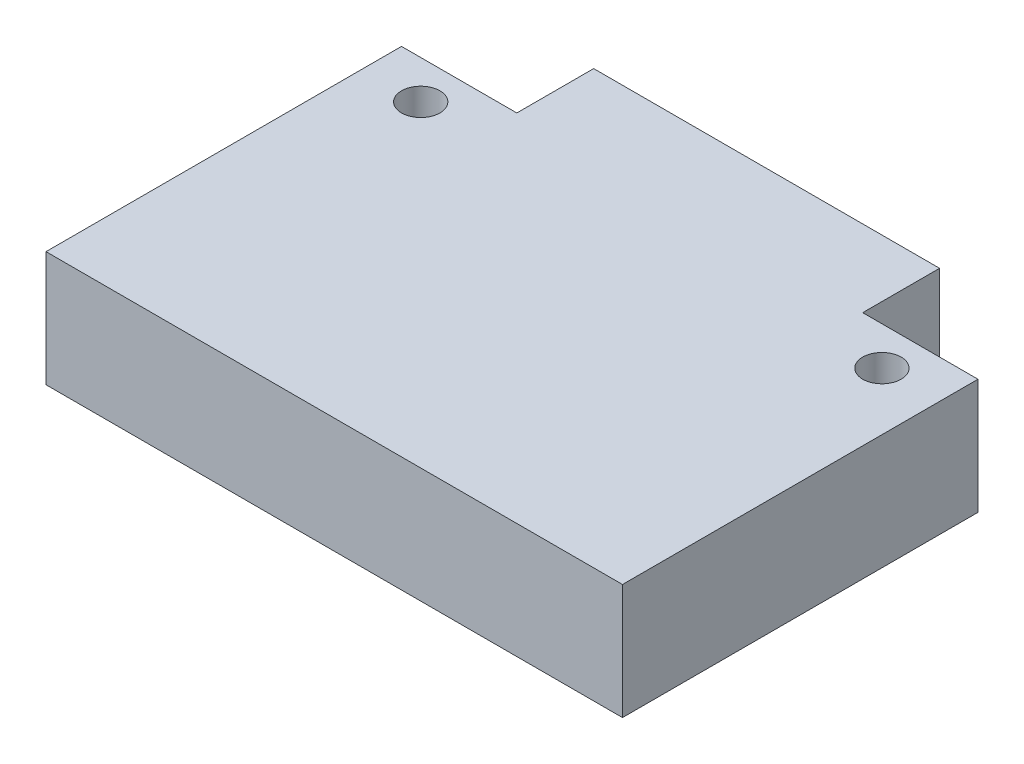
ISO-10303-21;
HEADER;
FILE_DESCRIPTION(('STEP AP214'),'2;1');
FILE_NAME('part.step','',(''),(''),'','','');
FILE_SCHEMA(('AUTOMOTIVE_DESIGN { 1 0 10303 214 1 1 1 1 }'));
ENDSEC;
DATA;
#1=APPLICATION_CONTEXT('core data for automotive mechanical design processes');
#2=APPLICATION_PROTOCOL_DEFINITION('international standard','automotive_design',2000,#1);
#3=PRODUCT_CONTEXT('',#1,'mechanical');
#4=PRODUCT('Part','Part','',(#3));
#5=PRODUCT_RELATED_PRODUCT_CATEGORY('part','',(#4));
#6=PRODUCT_DEFINITION_FORMATION('','',#4);
#7=PRODUCT_DEFINITION_CONTEXT('part definition',#1,'design');
#8=PRODUCT_DEFINITION('design','',#6,#7);
#9=PRODUCT_DEFINITION_SHAPE('','',#8);
#10=(LENGTH_UNIT() NAMED_UNIT(*) SI_UNIT(.MILLI.,.METRE.));
#11=(NAMED_UNIT(*) PLANE_ANGLE_UNIT() SI_UNIT($,.RADIAN.));
#12=(NAMED_UNIT(*) SI_UNIT($,.STERADIAN.) SOLID_ANGLE_UNIT());
#13=UNCERTAINTY_MEASURE_WITH_UNIT(LENGTH_MEASURE(1.E-05),#10,'distance_accuracy_value','');
#14=(GEOMETRIC_REPRESENTATION_CONTEXT(3) GLOBAL_UNCERTAINTY_ASSIGNED_CONTEXT((#13)) GLOBAL_UNIT_ASSIGNED_CONTEXT((#10,
#11,#12)) REPRESENTATION_CONTEXT('',''));
#15=CARTESIAN_POINT('',(0.,0.,0.));
#16=DIRECTION('',(0.,0.,1.));
#17=DIRECTION('',(1.,0.,0.));
#18=AXIS2_PLACEMENT_3D('',#15,#16,#17);
#19=CARTESIAN_POINT('',(0.,6.,0.));
#20=DIRECTION('',(1.,0.,0.));
#21=DIRECTION('',(0.,0.,-1.));
#22=AXIS2_PLACEMENT_3D('',#19,#20,#21);
#23=PLANE('',#22);
#24=DIRECTION('',(0.,0.,1.));
#25=VECTOR('',#24,1.);
#26=CARTESIAN_POINT('',(0.,0.,0.));
#27=LINE('',#26,#25);
#28=CARTESIAN_POINT('',(0.,0.,-18.5));
#29=VERTEX_POINT('',#28);
#30=CARTESIAN_POINT('',(0.,0.,0.));
#31=VERTEX_POINT('',#30);
#32=EDGE_CURVE('E131',#29,#31,#27,.T.);
#33=ORIENTED_EDGE('',*,*,#32,.T.);
#34=DIRECTION('',(0.,-1.,0.));
#35=VECTOR('',#34,1.);
#36=CARTESIAN_POINT('',(0.,6.,0.));
#37=LINE('',#36,#35);
#38=CARTESIAN_POINT('',(0.,6.,0.));
#39=VERTEX_POINT('',#38);
#40=EDGE_CURVE('E11',#39,#31,#37,.T.);
#41=ORIENTED_EDGE('',*,*,#40,.F.);
#42=DIRECTION('',(0.,0.,1.));
#43=VECTOR('',#42,1.);
#44=CARTESIAN_POINT('',(0.,6.,0.));
#45=LINE('',#44,#43);
#46=CARTESIAN_POINT('',(0.,6.,-18.5));
#47=VERTEX_POINT('',#46);
#48=EDGE_CURVE('E146',#47,#39,#45,.T.);
#49=ORIENTED_EDGE('',*,*,#48,.F.);
#50=DIRECTION('',(0.,-1.,0.));
#51=VECTOR('',#50,1.);
#52=CARTESIAN_POINT('',(0.,6.,-18.5));
#53=LINE('',#52,#51);
#54=EDGE_CURVE('E127',#47,#29,#53,.T.);
#55=ORIENTED_EDGE('',*,*,#54,.T.);
#56=EDGE_LOOP('',(#33,#41,#49,#55));
#57=FACE_BOUND('',#56,.T.);
#58=ADVANCED_FACE('F35',(#57),#23,.F.);
#59=CARTESIAN_POINT('',(0.,6.,0.));
#60=DIRECTION('',(0.,0.,-1.));
#61=DIRECTION('',(-1.,0.,0.));
#62=AXIS2_PLACEMENT_3D('',#59,#60,#61);
#63=PLANE('',#62);
#64=DIRECTION('',(1.,0.,0.));
#65=VECTOR('',#64,1.);
#66=CARTESIAN_POINT('',(0.,0.,0.));
#67=LINE('',#66,#65);
#68=CARTESIAN_POINT('',(30.,0.,0.));
#69=VERTEX_POINT('',#68);
#70=EDGE_CURVE('E134',#31,#69,#67,.T.);
#71=ORIENTED_EDGE('',*,*,#70,.T.);
#72=DIRECTION('',(0.,-1.,0.));
#73=VECTOR('',#72,1.);
#74=CARTESIAN_POINT('',(30.,6.,0.));
#75=LINE('',#74,#73);
#76=CARTESIAN_POINT('',(30.,6.,0.));
#77=VERTEX_POINT('',#76);
#78=EDGE_CURVE('E43',#77,#69,#75,.T.);
#79=ORIENTED_EDGE('',*,*,#78,.F.);
#80=DIRECTION('',(1.,0.,0.));
#81=VECTOR('',#80,1.);
#82=CARTESIAN_POINT('',(0.,6.,0.));
#83=LINE('',#82,#81);
#84=EDGE_CURVE('E94',#39,#77,#83,.T.);
#85=ORIENTED_EDGE('',*,*,#84,.F.);
#86=ORIENTED_EDGE('',*,*,#40,.T.);
#87=EDGE_LOOP('',(#71,#79,#85,#86));
#88=FACE_BOUND('',#87,.T.);
#89=ADVANCED_FACE('F215',(#88),#63,.F.);
#90=CARTESIAN_POINT('',(30.,6.,0.));
#91=DIRECTION('',(-1.,0.,0.));
#92=DIRECTION('',(0.,0.,1.));
#93=AXIS2_PLACEMENT_3D('',#90,#91,#92);
#94=PLANE('',#93);
#95=DIRECTION('',(0.,0.,-1.));
#96=VECTOR('',#95,1.);
#97=CARTESIAN_POINT('',(30.,0.,0.));
#98=LINE('',#97,#96);
#99=CARTESIAN_POINT('',(30.,0.,-18.5));
#100=VERTEX_POINT('',#99);
#101=EDGE_CURVE('E137',#69,#100,#98,.T.);
#102=ORIENTED_EDGE('',*,*,#101,.T.);
#103=DIRECTION('',(0.,-1.,0.));
#104=VECTOR('',#103,1.);
#105=CARTESIAN_POINT('',(30.,6.,-18.5));
#106=LINE('',#105,#104);
#107=CARTESIAN_POINT('',(30.,6.,-18.5));
#108=VERTEX_POINT('',#107);
#109=EDGE_CURVE('E153',#108,#100,#106,.T.);
#110=ORIENTED_EDGE('',*,*,#109,.F.);
#111=DIRECTION('',(0.,0.,-1.));
#112=VECTOR('',#111,1.);
#113=CARTESIAN_POINT('',(30.,6.,0.));
#114=LINE('',#113,#112);
#115=EDGE_CURVE('E161',#77,#108,#114,.T.);
#116=ORIENTED_EDGE('',*,*,#115,.F.);
#117=ORIENTED_EDGE('',*,*,#78,.T.);
#118=EDGE_LOOP('',(#102,#110,#116,#117));
#119=FACE_BOUND('',#118,.T.);
#120=ADVANCED_FACE('F159',(#119),#94,.F.);
#121=CARTESIAN_POINT('',(24.,6.,-18.5));
#122=DIRECTION('',(0.,0.,1.));
#123=DIRECTION('',(1.,0.,0.));
#124=AXIS2_PLACEMENT_3D('',#121,#122,#123);
#125=PLANE('',#124);
#126=DIRECTION('',(-1.,0.,0.));
#127=VECTOR('',#126,1.);
#128=CARTESIAN_POINT('',(24.,0.,-18.5));
#129=LINE('',#128,#127);
#130=CARTESIAN_POINT('',(24.,0.,-18.5));
#131=VERTEX_POINT('',#130);
#132=EDGE_CURVE('E139',#100,#131,#129,.T.);
#133=ORIENTED_EDGE('',*,*,#132,.T.);
#134=DIRECTION('',(0.,-1.,0.));
#135=VECTOR('',#134,1.);
#136=CARTESIAN_POINT('',(24.,6.,-18.5));
#137=LINE('',#136,#135);
#138=CARTESIAN_POINT('',(24.,6.,-18.5));
#139=VERTEX_POINT('',#138);
#140=EDGE_CURVE('E150',#139,#131,#137,.T.);
#141=ORIENTED_EDGE('',*,*,#140,.F.);
#142=DIRECTION('',(-1.,0.,0.));
#143=VECTOR('',#142,1.);
#144=CARTESIAN_POINT('',(24.,6.,-18.5));
#145=LINE('',#144,#143);
#146=EDGE_CURVE('E173',#108,#139,#145,.T.);
#147=ORIENTED_EDGE('',*,*,#146,.F.);
#148=ORIENTED_EDGE('',*,*,#109,.T.);
#149=EDGE_LOOP('',(#133,#141,#147,#148));
#150=FACE_BOUND('',#149,.T.);
#151=ADVANCED_FACE('F169',(#150),#125,.F.);
#152=CARTESIAN_POINT('',(24.,6.,-22.5));
#153=DIRECTION('',(-1.,0.,0.));
#154=DIRECTION('',(0.,0.,1.));
#155=AXIS2_PLACEMENT_3D('',#152,#153,#154);
#156=PLANE('',#155);
#157=DIRECTION('',(0.,0.,-1.));
#158=VECTOR('',#157,1.);
#159=CARTESIAN_POINT('',(24.,0.,-22.5));
#160=LINE('',#159,#158);
#161=CARTESIAN_POINT('',(24.,0.,-22.5));
#162=VERTEX_POINT('',#161);
#163=EDGE_CURVE('E141',#131,#162,#160,.T.);
#164=ORIENTED_EDGE('',*,*,#163,.T.);
#165=DIRECTION('',(0.,-1.,0.));
#166=VECTOR('',#165,1.);
#167=CARTESIAN_POINT('',(24.,6.,-22.5));
#168=LINE('',#167,#166);
#169=CARTESIAN_POINT('',(24.,6.,-22.5));
#170=VERTEX_POINT('',#169);
#171=EDGE_CURVE('E122',#170,#162,#168,.T.);
#172=ORIENTED_EDGE('',*,*,#171,.F.);
#173=DIRECTION('',(0.,0.,-1.));
#174=VECTOR('',#173,1.);
#175=CARTESIAN_POINT('',(24.,6.,-22.5));
#176=LINE('',#175,#174);
#177=EDGE_CURVE('E113',#139,#170,#176,.T.);
#178=ORIENTED_EDGE('',*,*,#177,.F.);
#179=ORIENTED_EDGE('',*,*,#140,.T.);
#180=EDGE_LOOP('',(#164,#172,#178,#179));
#181=FACE_BOUND('',#180,.T.);
#182=ADVANCED_FACE('F172',(#181),#156,.F.);
#183=CARTESIAN_POINT('',(6.,6.,-22.5));
#184=DIRECTION('',(0.,0.,1.));
#185=DIRECTION('',(1.,0.,0.));
#186=AXIS2_PLACEMENT_3D('',#183,#184,#185);
#187=PLANE('',#186);
#188=DIRECTION('',(-1.,0.,0.));
#189=VECTOR('',#188,1.);
#190=CARTESIAN_POINT('',(6.,0.,-22.5));
#191=LINE('',#190,#189);
#192=CARTESIAN_POINT('',(6.,0.,-22.5));
#193=VERTEX_POINT('',#192);
#194=EDGE_CURVE('E121',#162,#193,#191,.T.);
#195=ORIENTED_EDGE('',*,*,#194,.T.);
#196=DIRECTION('',(0.,-1.,0.));
#197=VECTOR('',#196,1.);
#198=CARTESIAN_POINT('',(6.,6.,-22.5));
#199=LINE('',#198,#197);
#200=CARTESIAN_POINT('',(6.,6.,-22.5));
#201=VERTEX_POINT('',#200);
#202=EDGE_CURVE('E118',#201,#193,#199,.T.);
#203=ORIENTED_EDGE('',*,*,#202,.F.);
#204=DIRECTION('',(-1.,0.,0.));
#205=VECTOR('',#204,1.);
#206=CARTESIAN_POINT('',(6.,6.,-22.5));
#207=LINE('',#206,#205);
#208=EDGE_CURVE('E107',#170,#201,#207,.T.);
#209=ORIENTED_EDGE('',*,*,#208,.F.);
#210=ORIENTED_EDGE('',*,*,#171,.T.);
#211=EDGE_LOOP('',(#195,#203,#209,#210));
#212=FACE_BOUND('',#211,.T.);
#213=ADVANCED_FACE('F119',(#212),#187,.F.);
#214=CARTESIAN_POINT('',(6.,6.,-18.5));
#215=DIRECTION('',(1.,0.,0.));
#216=DIRECTION('',(0.,0.,-1.));
#217=AXIS2_PLACEMENT_3D('',#214,#215,#216);
#218=PLANE('',#217);
#219=DIRECTION('',(0.,0.,1.));
#220=VECTOR('',#219,1.);
#221=CARTESIAN_POINT('',(6.,0.,-18.5));
#222=LINE('',#221,#220);
#223=CARTESIAN_POINT('',(6.,0.,-18.5));
#224=VERTEX_POINT('',#223);
#225=EDGE_CURVE('E80',#193,#224,#222,.T.);
#226=ORIENTED_EDGE('',*,*,#225,.T.);
#227=DIRECTION('',(0.,-1.,0.));
#228=VECTOR('',#227,1.);
#229=CARTESIAN_POINT('',(6.,6.,-18.5));
#230=LINE('',#229,#228);
#231=CARTESIAN_POINT('',(6.,6.,-18.5));
#232=VERTEX_POINT('',#231);
#233=EDGE_CURVE('E123',#232,#224,#230,.T.);
#234=ORIENTED_EDGE('',*,*,#233,.F.);
#235=DIRECTION('',(0.,0.,1.));
#236=VECTOR('',#235,1.);
#237=CARTESIAN_POINT('',(6.,6.,-18.5));
#238=LINE('',#237,#236);
#239=EDGE_CURVE('E111',#201,#232,#238,.T.);
#240=ORIENTED_EDGE('',*,*,#239,.F.);
#241=ORIENTED_EDGE('',*,*,#202,.T.);
#242=EDGE_LOOP('',(#226,#234,#240,#241));
#243=FACE_BOUND('',#242,.T.);
#244=ADVANCED_FACE('F125',(#243),#218,.F.);
#245=CARTESIAN_POINT('',(0.,6.,-18.5));
#246=DIRECTION('',(0.,0.,1.));
#247=DIRECTION('',(1.,0.,0.));
#248=AXIS2_PLACEMENT_3D('',#245,#246,#247);
#249=PLANE('',#248);
#250=DIRECTION('',(-1.,0.,0.));
#251=VECTOR('',#250,1.);
#252=CARTESIAN_POINT('',(0.,0.,-18.5));
#253=LINE('',#252,#251);
#254=EDGE_CURVE('E86',#224,#29,#253,.T.);
#255=ORIENTED_EDGE('',*,*,#254,.T.);
#256=ORIENTED_EDGE('',*,*,#54,.F.);
#257=DIRECTION('',(-1.,0.,0.));
#258=VECTOR('',#257,1.);
#259=CARTESIAN_POINT('',(0.,6.,-18.5));
#260=LINE('',#259,#258);
#261=EDGE_CURVE('E51',#232,#47,#260,.T.);
#262=ORIENTED_EDGE('',*,*,#261,.F.);
#263=ORIENTED_EDGE('',*,*,#233,.T.);
#264=EDGE_LOOP('',(#255,#256,#262,#263));
#265=FACE_BOUND('',#264,.T.);
#266=ADVANCED_FACE('F202',(#265),#249,.F.);
#267=CARTESIAN_POINT('',(0.,6.,0.));
#268=DIRECTION('',(0.,-1.,0.));
#269=DIRECTION('',(0.,0.,-1.));
#270=AXIS2_PLACEMENT_3D('',#267,#268,#269);
#271=PLANE('',#270);
#272=CARTESIAN_POINT('',(27.,6.,-16.5));
#273=DIRECTION('',(0.,1.,0.));
#274=DIRECTION('',(0.,0.,1.));
#275=AXIS2_PLACEMENT_3D('',#272,#273,#274);
#276=CIRCLE('',#275,1.);
#277=CARTESIAN_POINT('',(27.,6.,-15.5));
#278=VERTEX_POINT('',#277);
#279=EDGE_CURVE('E185',#278,#278,#276,.T.);
#280=ORIENTED_EDGE('',*,*,#279,.F.);
#281=EDGE_LOOP('',(#280));
#282=FACE_BOUND('',#281,.T.);
#283=CARTESIAN_POINT('',(3.,6.,-16.5));
#284=DIRECTION('',(0.,1.,0.));
#285=DIRECTION('',(0.,0.,1.));
#286=AXIS2_PLACEMENT_3D('',#283,#284,#285);
#287=CIRCLE('',#286,1.);
#288=CARTESIAN_POINT('',(3.,6.,-15.5));
#289=VERTEX_POINT('',#288);
#290=EDGE_CURVE('E179',#289,#289,#287,.T.);
#291=ORIENTED_EDGE('',*,*,#290,.F.);
#292=EDGE_LOOP('',(#291));
#293=FACE_BOUND('',#292,.T.);
#294=ORIENTED_EDGE('',*,*,#48,.T.);
#295=ORIENTED_EDGE('',*,*,#84,.T.);
#296=ORIENTED_EDGE('',*,*,#115,.T.);
#297=ORIENTED_EDGE('',*,*,#146,.T.);
#298=ORIENTED_EDGE('',*,*,#177,.T.);
#299=ORIENTED_EDGE('',*,*,#208,.T.);
#300=ORIENTED_EDGE('',*,*,#239,.T.);
#301=ORIENTED_EDGE('',*,*,#261,.T.);
#302=EDGE_LOOP('',(#294,#295,#296,#297,#298,#299,#300,#301));
#303=FACE_BOUND('',#302,.T.);
#304=ADVANCED_FACE('F109',(#282,#293,#303),#271,.F.);
#305=CARTESIAN_POINT('',(0.,0.,0.));
#306=DIRECTION('',(0.,-1.,0.));
#307=DIRECTION('',(0.,0.,-1.));
#308=AXIS2_PLACEMENT_3D('',#305,#306,#307);
#309=PLANE('',#308);
#310=CARTESIAN_POINT('',(27.,0.,-16.5));
#311=DIRECTION('',(0.,1.,0.));
#312=DIRECTION('',(0.,0.,1.));
#313=AXIS2_PLACEMENT_3D('',#310,#311,#312);
#314=CIRCLE('',#313,1.);
#315=CARTESIAN_POINT('',(27.,0.,-15.5));
#316=VERTEX_POINT('',#315);
#317=EDGE_CURVE('E182',#316,#316,#314,.T.);
#318=ORIENTED_EDGE('',*,*,#317,.T.);
#319=EDGE_LOOP('',(#318));
#320=FACE_BOUND('',#319,.T.);
#321=CARTESIAN_POINT('',(3.,0.,-16.5));
#322=DIRECTION('',(0.,1.,0.));
#323=DIRECTION('',(0.,0.,1.));
#324=AXIS2_PLACEMENT_3D('',#321,#322,#323);
#325=CIRCLE('',#324,1.);
#326=CARTESIAN_POINT('',(3.,0.,-15.5));
#327=VERTEX_POINT('',#326);
#328=EDGE_CURVE('E135',#327,#327,#325,.T.);
#329=ORIENTED_EDGE('',*,*,#328,.T.);
#330=EDGE_LOOP('',(#329));
#331=FACE_BOUND('',#330,.T.);
#332=ORIENTED_EDGE('',*,*,#32,.F.);
#333=ORIENTED_EDGE('',*,*,#254,.F.);
#334=ORIENTED_EDGE('',*,*,#225,.F.);
#335=ORIENTED_EDGE('',*,*,#194,.F.);
#336=ORIENTED_EDGE('',*,*,#163,.F.);
#337=ORIENTED_EDGE('',*,*,#132,.F.);
#338=ORIENTED_EDGE('',*,*,#101,.F.);
#339=ORIENTED_EDGE('',*,*,#70,.F.);
#340=EDGE_LOOP('',(#332,#333,#334,#335,#336,#337,#338,#339));
#341=FACE_BOUND('',#340,.T.);
#342=ADVANCED_FACE('F165',(#320,#331,#341),#309,.T.);
#343=CARTESIAN_POINT('',(3.,0.,-16.5));
#344=DIRECTION('',(0.,1.,0.));
#345=DIRECTION('',(0.,0.,1.));
#346=AXIS2_PLACEMENT_3D('',#343,#344,#345);
#347=CYLINDRICAL_SURFACE('',#346,1.);
#348=ORIENTED_EDGE('',*,*,#328,.F.);
#349=EDGE_LOOP('',(#348));
#350=FACE_BOUND('',#349,.T.);
#351=ORIENTED_EDGE('',*,*,#290,.T.);
#352=EDGE_LOOP('',(#351));
#353=FACE_BOUND('',#352,.T.);
#354=ADVANCED_FACE('F196',(#350,#353),#347,.F.);
#355=CARTESIAN_POINT('',(27.,0.,-16.5));
#356=DIRECTION('',(0.,1.,0.));
#357=DIRECTION('',(0.,0.,1.));
#358=AXIS2_PLACEMENT_3D('',#355,#356,#357);
#359=CYLINDRICAL_SURFACE('',#358,1.);
#360=ORIENTED_EDGE('',*,*,#317,.F.);
#361=EDGE_LOOP('',(#360));
#362=FACE_BOUND('',#361,.T.);
#363=ORIENTED_EDGE('',*,*,#279,.T.);
#364=EDGE_LOOP('',(#363));
#365=FACE_BOUND('',#364,.T.);
#366=ADVANCED_FACE('F193',(#362,#365),#359,.F.);
#367=CLOSED_SHELL('',(#58,#89,#120,#151,#182,#213,#244,#266,#304,#342,#354,#366));
#368=MANIFOLD_SOLID_BREP('B2',#367);
#369=ADVANCED_BREP_SHAPE_REPRESENTATION('',(#18,#368),#14);
#370=SHAPE_DEFINITION_REPRESENTATION(#9,#369);
ENDSEC;
END-ISO-10303-21;
